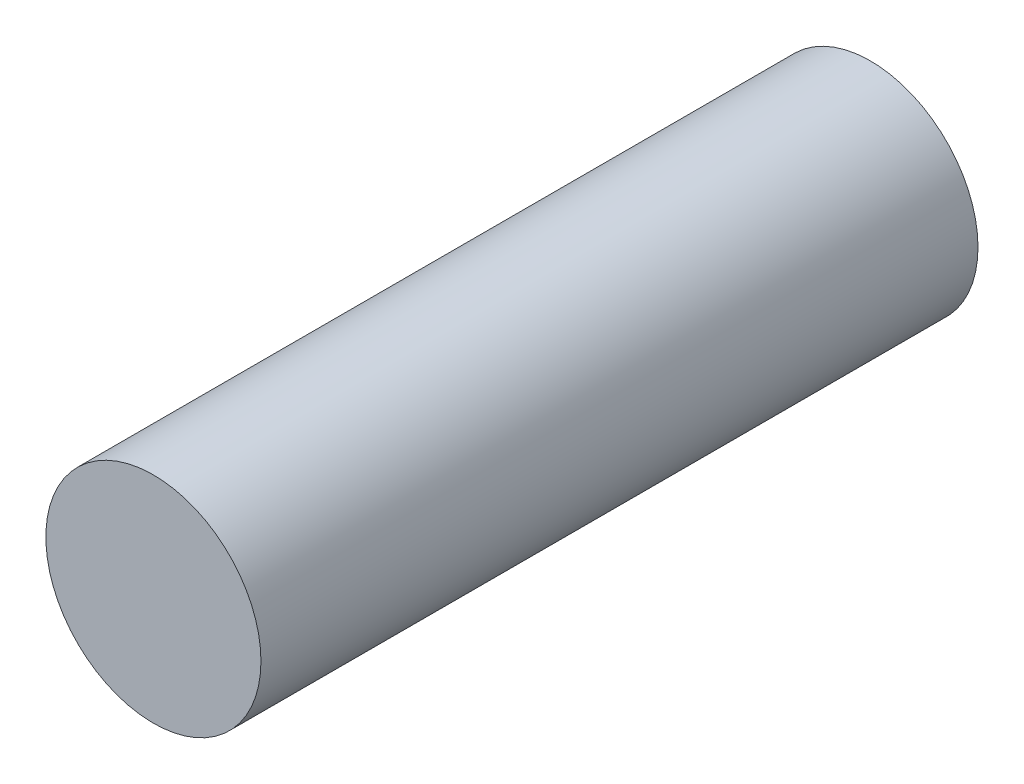
ISO-10303-21;
HEADER;
FILE_DESCRIPTION(('STEP AP214'),'2;1');
FILE_NAME('part.step','',(''),(''),'','','');
FILE_SCHEMA(('AUTOMOTIVE_DESIGN { 1 0 10303 214 1 1 1 1 }'));
ENDSEC;
DATA;
#1=APPLICATION_CONTEXT('core data for automotive mechanical design processes');
#2=APPLICATION_PROTOCOL_DEFINITION('international standard','automotive_design',2000,#1);
#3=PRODUCT_CONTEXT('',#1,'mechanical');
#4=PRODUCT('Part','Part','',(#3));
#5=PRODUCT_RELATED_PRODUCT_CATEGORY('part','',(#4));
#6=PRODUCT_DEFINITION_FORMATION('','',#4);
#7=PRODUCT_DEFINITION_CONTEXT('part definition',#1,'design');
#8=PRODUCT_DEFINITION('design','',#6,#7);
#9=PRODUCT_DEFINITION_SHAPE('','',#8);
#10=(LENGTH_UNIT() NAMED_UNIT(*) SI_UNIT(.MILLI.,.METRE.));
#11=(NAMED_UNIT(*) PLANE_ANGLE_UNIT() SI_UNIT($,.RADIAN.));
#12=(NAMED_UNIT(*) SI_UNIT($,.STERADIAN.) SOLID_ANGLE_UNIT());
#13=UNCERTAINTY_MEASURE_WITH_UNIT(LENGTH_MEASURE(1.E-05),#10,'distance_accuracy_value','');
#14=(GEOMETRIC_REPRESENTATION_CONTEXT(3) GLOBAL_UNCERTAINTY_ASSIGNED_CONTEXT((#13)) GLOBAL_UNIT_ASSIGNED_CONTEXT((#10,
#11,#12)) REPRESENTATION_CONTEXT('',''));
#15=CARTESIAN_POINT('',(0.,0.,0.));
#16=DIRECTION('',(0.,0.,1.));
#17=DIRECTION('',(1.,0.,0.));
#18=AXIS2_PLACEMENT_3D('',#15,#16,#17);
#19=CARTESIAN_POINT('',(0.,0.,508.));
#20=DIRECTION('',(0.,0.,-1.));
#21=DIRECTION('',(-1.,0.,0.));
#22=AXIS2_PLACEMENT_3D('',#19,#20,#21);
#23=CYLINDRICAL_SURFACE('',#22,76.2);
#24=CARTESIAN_POINT('',(0.,0.,508.));
#25=DIRECTION('',(0.,0.,1.));
#26=DIRECTION('',(1.,0.,0.));
#27=AXIS2_PLACEMENT_3D('',#24,#25,#26);
#28=CIRCLE('',#27,76.2);
#29=CARTESIAN_POINT('',(76.2,0.,508.));
#30=VERTEX_POINT('',#29);
#31=EDGE_CURVE('E10',#30,#30,#28,.T.);
#32=ORIENTED_EDGE('',*,*,#31,.F.);
#33=EDGE_LOOP('',(#32));
#34=FACE_BOUND('',#33,.T.);
#35=CARTESIAN_POINT('',(0.,0.,0.));
#36=DIRECTION('',(0.,0.,1.));
#37=DIRECTION('',(1.,0.,0.));
#38=AXIS2_PLACEMENT_3D('',#35,#36,#37);
#39=CIRCLE('',#38,76.2);
#40=CARTESIAN_POINT('',(76.2,0.,0.));
#41=VERTEX_POINT('',#40);
#42=EDGE_CURVE('E36',#41,#41,#39,.T.);
#43=ORIENTED_EDGE('',*,*,#42,.T.);
#44=EDGE_LOOP('',(#43));
#45=FACE_BOUND('',#44,.T.);
#46=ADVANCED_FACE('F33',(#34,#45),#23,.T.);
#47=CARTESIAN_POINT('',(0.,0.,508.));
#48=DIRECTION('',(0.,0.,1.));
#49=DIRECTION('',(1.,0.,0.));
#50=AXIS2_PLACEMENT_3D('',#47,#48,#49);
#51=PLANE('',#50);
#52=ORIENTED_EDGE('',*,*,#31,.T.);
#53=EDGE_LOOP('',(#52));
#54=FACE_BOUND('',#53,.T.);
#55=ADVANCED_FACE('F48',(#54),#51,.T.);
#56=CARTESIAN_POINT('',(0.,0.,0.));
#57=DIRECTION('',(0.,0.,1.));
#58=DIRECTION('',(1.,0.,0.));
#59=AXIS2_PLACEMENT_3D('',#56,#57,#58);
#60=PLANE('',#59);
#61=ORIENTED_EDGE('',*,*,#42,.F.);
#62=EDGE_LOOP('',(#61));
#63=FACE_BOUND('',#62,.T.);
#64=ADVANCED_FACE('F46',(#63),#60,.F.);
#65=CLOSED_SHELL('',(#46,#55,#64));
#66=MANIFOLD_SOLID_BREP('B2',#65);
#67=ADVANCED_BREP_SHAPE_REPRESENTATION('',(#18,#66),#14);
#68=SHAPE_DEFINITION_REPRESENTATION(#9,#67);
ENDSEC;
END-ISO-10303-21;
